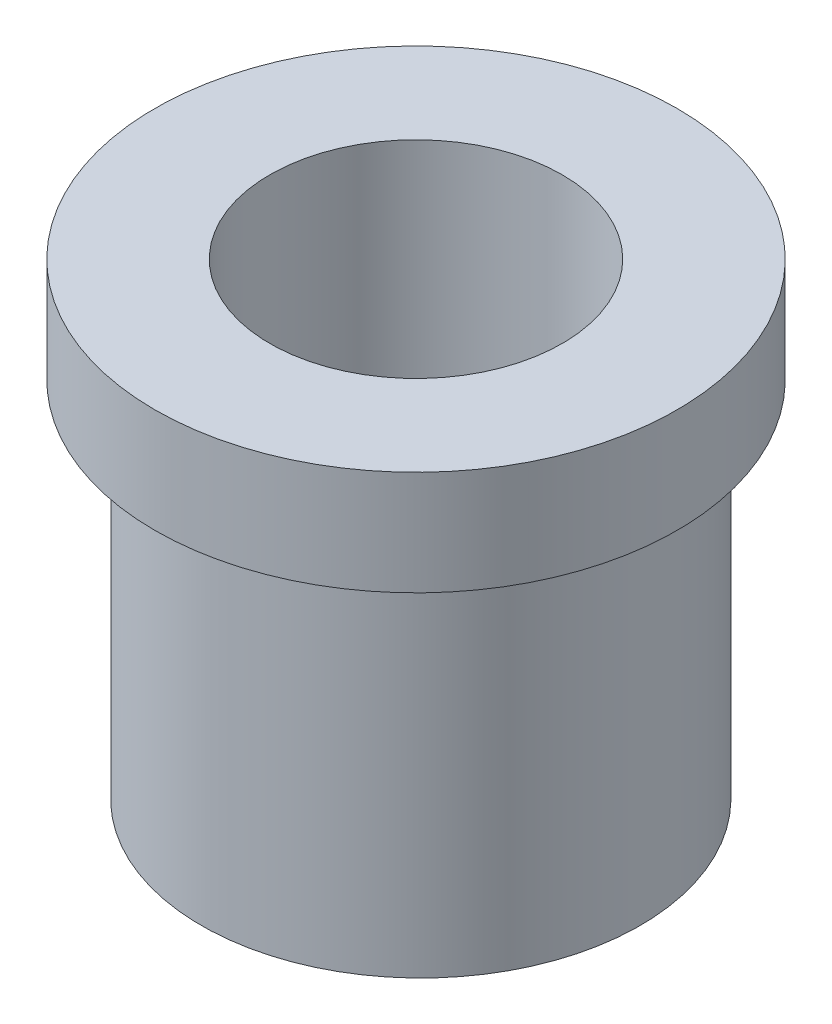
ISO-10303-21;
HEADER;
FILE_DESCRIPTION(('STEP AP214'),'2;1');
FILE_NAME('part.step','',(''),(''),'','','');
FILE_SCHEMA(('AUTOMOTIVE_DESIGN { 1 0 10303 214 1 1 1 1 }'));
ENDSEC;
DATA;
#1=APPLICATION_CONTEXT('core data for automotive mechanical design processes');
#2=APPLICATION_PROTOCOL_DEFINITION('international standard','automotive_design',2000,#1);
#3=PRODUCT_CONTEXT('',#1,'mechanical');
#4=PRODUCT('Part','Part','',(#3));
#5=PRODUCT_RELATED_PRODUCT_CATEGORY('part','',(#4));
#6=PRODUCT_DEFINITION_FORMATION('','',#4);
#7=PRODUCT_DEFINITION_CONTEXT('part definition',#1,'design');
#8=PRODUCT_DEFINITION('design','',#6,#7);
#9=PRODUCT_DEFINITION_SHAPE('','',#8);
#10=(LENGTH_UNIT() NAMED_UNIT(*) SI_UNIT(.MILLI.,.METRE.));
#11=(NAMED_UNIT(*) PLANE_ANGLE_UNIT() SI_UNIT($,.RADIAN.));
#12=(NAMED_UNIT(*) SI_UNIT($,.STERADIAN.) SOLID_ANGLE_UNIT());
#13=UNCERTAINTY_MEASURE_WITH_UNIT(LENGTH_MEASURE(1.E-05),#10,'distance_accuracy_value','');
#14=(GEOMETRIC_REPRESENTATION_CONTEXT(3) GLOBAL_UNCERTAINTY_ASSIGNED_CONTEXT((#13)) GLOBAL_UNIT_ASSIGNED_CONTEXT((#10,
#11,#12)) REPRESENTATION_CONTEXT('',''));
#15=CARTESIAN_POINT('',(0.,0.,0.));
#16=DIRECTION('',(0.,0.,1.));
#17=DIRECTION('',(1.,0.,0.));
#18=AXIS2_PLACEMENT_3D('',#15,#16,#17);
#19=CARTESIAN_POINT('',(0.,45.,-0.455240014745839));
#20=DIRECTION('',(0.,-1.,0.));
#21=DIRECTION('',(0.,0.,-1.));
#22=AXIS2_PLACEMENT_3D('',#19,#20,#21);
#23=CYLINDRICAL_SURFACE('',#22,21.);
#24=CARTESIAN_POINT('',(0.,0.,-0.455240014745839));
#25=DIRECTION('',(0.,1.,0.));
#26=DIRECTION('',(0.,0.,1.));
#27=AXIS2_PLACEMENT_3D('',#24,#25,#26);
#28=CIRCLE('',#27,21.);
#29=CARTESIAN_POINT('',(0.,0.,-21.4552400147458));
#30=VERTEX_POINT('',#29);
#31=EDGE_CURVE('E40',#30,#30,#28,.T.);
#32=CARTESIAN_POINT('',(0.,35.,-0.455240014745839));
#33=DIRECTION('',(0.,1.,0.));
#34=DIRECTION('',(0.,0.,1.));
#35=AXIS2_PLACEMENT_3D('',#32,#33,#34);
#36=CIRCLE('',#35,21.);
#37=CARTESIAN_POINT('',(0.,35.,-21.4552400147458));
#38=VERTEX_POINT('',#37);
#39=EDGE_CURVE('E10',#38,#38,#36,.T.);
#40=CARTESIAN_POINT('',(0.,0.,-21.4552400147458));
#41=CARTESIAN_POINT('',(0.,0.364583333333325,-21.4552400147458));
#42=CARTESIAN_POINT('',(0.,0.729166666666658,-21.4552400147458));
#43=CARTESIAN_POINT('',(0.,1.45833333333333,-21.4552400147458));
#44=CARTESIAN_POINT('',(0.,1.82291666666666,-21.4552400147458));
#45=CARTESIAN_POINT('',(0.,2.55208333333333,-21.4552400147458));
#46=CARTESIAN_POINT('',(0.,2.91666666666666,-21.4552400147458));
#47=CARTESIAN_POINT('',(0.,3.64583333333333,-21.4552400147458));
#48=CARTESIAN_POINT('',(0.,4.01041666666666,-21.4552400147458));
#49=CARTESIAN_POINT('',(0.,4.73958333333333,-21.4552400147458));
#50=CARTESIAN_POINT('',(0.,5.10416666666666,-21.4552400147458));
#51=CARTESIAN_POINT('',(0.,5.83333333333333,-21.4552400147458));
#52=CARTESIAN_POINT('',(0.,6.19791666666666,-21.4552400147458));
#53=CARTESIAN_POINT('',(0.,6.92708333333333,-21.4552400147458));
#54=CARTESIAN_POINT('',(0.,7.29166666666666,-21.4552400147458));
#55=CARTESIAN_POINT('',(0.,8.02083333333333,-21.4552400147458));
#56=CARTESIAN_POINT('',(0.,8.38541666666666,-21.4552400147458));
#57=CARTESIAN_POINT('',(0.,9.11458333333333,-21.4552400147458));
#58=CARTESIAN_POINT('',(0.,9.47916666666666,-21.4552400147458));
#59=CARTESIAN_POINT('',(0.,10.2083333333333,-21.4552400147458));
#60=CARTESIAN_POINT('',(0.,10.5729166666667,-21.4552400147458));
#61=CARTESIAN_POINT('',(0.,11.3020833333333,-21.4552400147458));
#62=CARTESIAN_POINT('',(0.,11.6666666666667,-21.4552400147458));
#63=CARTESIAN_POINT('',(0.,12.3958333333333,-21.4552400147458));
#64=CARTESIAN_POINT('',(0.,12.7604166666667,-21.4552400147458));
#65=CARTESIAN_POINT('',(0.,13.4895833333333,-21.4552400147458));
#66=CARTESIAN_POINT('',(0.,13.8541666666667,-21.4552400147458));
#67=CARTESIAN_POINT('',(0.,14.5833333333333,-21.4552400147458));
#68=CARTESIAN_POINT('',(0.,14.9479166666667,-21.4552400147458));
#69=CARTESIAN_POINT('',(0.,15.6770833333333,-21.4552400147458));
#70=CARTESIAN_POINT('',(0.,16.0416666666667,-21.4552400147458));
#71=CARTESIAN_POINT('',(0.,16.7708333333333,-21.4552400147458));
#72=CARTESIAN_POINT('',(0.,17.1354166666667,-21.4552400147458));
#73=CARTESIAN_POINT('',(0.,17.8645833333333,-21.4552400147458));
#74=CARTESIAN_POINT('',(0.,18.2291666666667,-21.4552400147458));
#75=CARTESIAN_POINT('',(0.,18.9583333333333,-21.4552400147458));
#76=CARTESIAN_POINT('',(0.,19.3229166666667,-21.4552400147458));
#77=CARTESIAN_POINT('',(0.,20.0520833333333,-21.4552400147458));
#78=CARTESIAN_POINT('',(0.,20.4166666666667,-21.4552400147458));
#79=CARTESIAN_POINT('',(0.,21.1458333333333,-21.4552400147458));
#80=CARTESIAN_POINT('',(0.,21.5104166666667,-21.4552400147458));
#81=CARTESIAN_POINT('',(0.,22.2395833333333,-21.4552400147458));
#82=CARTESIAN_POINT('',(0.,22.6041666666667,-21.4552400147458));
#83=CARTESIAN_POINT('',(0.,23.3333333333333,-21.4552400147458));
#84=CARTESIAN_POINT('',(0.,23.6979166666667,-21.4552400147458));
#85=CARTESIAN_POINT('',(0.,24.4270833333333,-21.4552400147458));
#86=CARTESIAN_POINT('',(0.,24.7916666666667,-21.4552400147458));
#87=CARTESIAN_POINT('',(0.,25.5208333333333,-21.4552400147458));
#88=CARTESIAN_POINT('',(0.,25.8854166666667,-21.4552400147458));
#89=CARTESIAN_POINT('',(0.,26.6145833333333,-21.4552400147458));
#90=CARTESIAN_POINT('',(0.,26.9791666666667,-21.4552400147458));
#91=CARTESIAN_POINT('',(0.,27.7083333333333,-21.4552400147458));
#92=CARTESIAN_POINT('',(0.,28.0729166666667,-21.4552400147458));
#93=CARTESIAN_POINT('',(0.,28.8020833333333,-21.4552400147458));
#94=CARTESIAN_POINT('',(0.,29.1666666666667,-21.4552400147458));
#95=CARTESIAN_POINT('',(0.,29.8958333333333,-21.4552400147458));
#96=CARTESIAN_POINT('',(0.,30.2604166666667,-21.4552400147458));
#97=CARTESIAN_POINT('',(0.,30.9895833333333,-21.4552400147458));
#98=CARTESIAN_POINT('',(0.,31.3541666666667,-21.4552400147458));
#99=CARTESIAN_POINT('',(0.,32.0833333333333,-21.4552400147458));
#100=CARTESIAN_POINT('',(0.,32.4479166666667,-21.4552400147458));
#101=CARTESIAN_POINT('',(0.,33.1770833333333,-21.4552400147458));
#102=CARTESIAN_POINT('',(0.,33.5416666666667,-21.4552400147458));
#103=CARTESIAN_POINT('',(0.,34.2708333333333,-21.4552400147458));
#104=CARTESIAN_POINT('',(0.,34.6354166666667,-21.4552400147458));
#105=CARTESIAN_POINT('',(0.,35.,-21.4552400147458));
#106=B_SPLINE_CURVE_WITH_KNOTS('',3,(#40,#41,#42,#43,#44,#45,#46,#47,#48,#49,#50,#51,#52,#53,
#54,#55,#56,#57,#58,#59,#60,#61,#62,#63,#64,#65,#66,#67,#68,#69,#70,#71,#72,#73,#74,#75,#76,#77,
#78,#79,#80,#81,#82,#83,#84,#85,#86,#87,#88,#89,#90,#91,#92,#93,#94,#95,#96,#97,#98,#99,#100,
#101,#102,#103,#104,#105),.UNSPECIFIED.,.F.,.F.,(4,2,2,2,2,2,2,2,2,2,2,2,2,2,2,2,2,2,2,2,2,2,2,
2,2,2,2,2,2,2,2,2,4),(0.,1.09375,2.1875,3.28125,4.375,5.46875,6.5625,7.65625,8.75,9.84375,
10.9375,12.03125,13.125,14.21875,15.3125,16.40625,17.5,18.59375,19.6875,20.78125,21.875,
22.96875,24.0625,25.15625,26.25,27.34375,28.4375,29.53125,30.625,31.71875,32.8125,33.90625,35.),.UNSPECIFIED.);
#107=EDGE_CURVE('BSEAM37',#30,#38,#106,.T.);
#108=ORIENTED_EDGE('',*,*,#31,.T.);
#109=ORIENTED_EDGE('',*,*,#39,.F.);
#110=ORIENTED_EDGE('',*,*,#107,.T.);
#111=ORIENTED_EDGE('',*,*,#107,.F.);
#112=EDGE_LOOP('',(#108,#110,#109,#111));
#113=FACE_BOUND('',#112,.T.);
#114=ADVANCED_FACE('F37',(#113),#23,.T.);
#115=CARTESIAN_POINT('',(0.,45.,-0.455240014745839));
#116=DIRECTION('',(0.,1.,0.));
#117=DIRECTION('',(0.,0.,1.));
#118=AXIS2_PLACEMENT_3D('',#115,#116,#117);
#119=PLANE('',#118);
#120=CARTESIAN_POINT('',(0.,45.,0.));
#121=DIRECTION('',(0.,1.,0.));
#122=DIRECTION('',(0.,0.,1.));
#123=AXIS2_PLACEMENT_3D('',#120,#121,#122);
#124=CIRCLE('',#123,14.);
#125=CARTESIAN_POINT('',(0.,45.,-14.));
#126=VERTEX_POINT('',#125);
#127=EDGE_CURVE('E48',#126,#126,#124,.T.);
#128=ORIENTED_EDGE('',*,*,#127,.F.);
#129=EDGE_LOOP('',(#128));
#130=FACE_BOUND('',#129,.T.);
#131=CARTESIAN_POINT('',(0.,45.,0.));
#132=DIRECTION('',(0.,1.,0.));
#133=DIRECTION('',(0.,0.,1.));
#134=AXIS2_PLACEMENT_3D('',#131,#132,#133);
#135=CIRCLE('',#134,25.);
#136=CARTESIAN_POINT('',(0.,45.,25.));
#137=VERTEX_POINT('',#136);
#138=EDGE_CURVE('E51',#137,#137,#135,.T.);
#139=ORIENTED_EDGE('',*,*,#138,.T.);
#140=EDGE_LOOP('',(#139));
#141=FACE_BOUND('',#140,.T.);
#142=ADVANCED_FACE('F65',(#130,#141),#119,.T.);
#143=CARTESIAN_POINT('',(0.,0.,-0.455240014745839));
#144=DIRECTION('',(0.,1.,0.));
#145=DIRECTION('',(0.,0.,1.));
#146=AXIS2_PLACEMENT_3D('',#143,#144,#145);
#147=PLANE('',#146);
#148=ORIENTED_EDGE('',*,*,#31,.F.);
#149=EDGE_LOOP('',(#148));
#150=FACE_BOUND('',#149,.T.);
#151=CARTESIAN_POINT('',(0.,0.,0.));
#152=DIRECTION('',(0.,1.,0.));
#153=DIRECTION('',(0.,0.,1.));
#154=AXIS2_PLACEMENT_3D('',#151,#152,#153);
#155=CIRCLE('',#154,14.);
#156=CARTESIAN_POINT('',(0.,0.,-14.));
#157=VERTEX_POINT('',#156);
#158=EDGE_CURVE('E54',#157,#157,#155,.T.);
#159=ORIENTED_EDGE('',*,*,#158,.T.);
#160=EDGE_LOOP('',(#159));
#161=FACE_BOUND('',#160,.T.);
#162=ADVANCED_FACE('F83',(#150,#161),#147,.F.);
#163=CARTESIAN_POINT('',(0.,45.,0.));
#164=DIRECTION('',(0.,-1.,0.));
#165=DIRECTION('',(0.,0.,-1.));
#166=AXIS2_PLACEMENT_3D('',#163,#164,#165);
#167=CYLINDRICAL_SURFACE('',#166,14.);
#168=CARTESIAN_POINT('',(0.,45.,-14.));
#169=CARTESIAN_POINT('',(0.,44.53125,-14.));
#170=CARTESIAN_POINT('',(0.,44.0625,-14.));
#171=CARTESIAN_POINT('',(0.,43.125,-14.));
#172=CARTESIAN_POINT('',(0.,42.65625,-14.));
#173=CARTESIAN_POINT('',(0.,41.71875,-14.));
#174=CARTESIAN_POINT('',(0.,41.25,-14.));
#175=CARTESIAN_POINT('',(0.,40.3125,-14.));
#176=CARTESIAN_POINT('',(0.,39.84375,-14.));
#177=CARTESIAN_POINT('',(0.,38.90625,-14.));
#178=CARTESIAN_POINT('',(0.,38.4375,-14.));
#179=CARTESIAN_POINT('',(0.,37.5,-14.));
#180=CARTESIAN_POINT('',(0.,37.03125,-14.));
#181=CARTESIAN_POINT('',(0.,36.09375,-14.));
#182=CARTESIAN_POINT('',(0.,35.625,-14.));
#183=CARTESIAN_POINT('',(0.,34.6875,-14.));
#184=CARTESIAN_POINT('',(0.,34.21875,-14.));
#185=CARTESIAN_POINT('',(0.,33.28125,-14.));
#186=CARTESIAN_POINT('',(0.,32.8125,-14.));
#187=CARTESIAN_POINT('',(0.,31.875,-14.));
#188=CARTESIAN_POINT('',(0.,31.40625,-14.));
#189=CARTESIAN_POINT('',(0.,30.46875,-14.));
#190=CARTESIAN_POINT('',(0.,30.,-14.));
#191=CARTESIAN_POINT('',(0.,29.0625,-14.));
#192=CARTESIAN_POINT('',(0.,28.59375,-14.));
#193=CARTESIAN_POINT('',(0.,27.65625,-14.));
#194=CARTESIAN_POINT('',(0.,27.1875,-14.));
#195=CARTESIAN_POINT('',(0.,26.25,-14.));
#196=CARTESIAN_POINT('',(0.,25.78125,-14.));
#197=CARTESIAN_POINT('',(0.,24.84375,-14.));
#198=CARTESIAN_POINT('',(0.,24.375,-14.));
#199=CARTESIAN_POINT('',(0.,23.4375,-14.));
#200=CARTESIAN_POINT('',(0.,22.96875,-14.));
#201=CARTESIAN_POINT('',(0.,22.03125,-14.));
#202=CARTESIAN_POINT('',(0.,21.5625,-14.));
#203=CARTESIAN_POINT('',(0.,20.625,-14.));
#204=CARTESIAN_POINT('',(0.,20.15625,-14.));
#205=CARTESIAN_POINT('',(0.,19.21875,-14.));
#206=CARTESIAN_POINT('',(0.,18.75,-14.));
#207=CARTESIAN_POINT('',(0.,17.8125,-14.));
#208=CARTESIAN_POINT('',(0.,17.34375,-14.));
#209=CARTESIAN_POINT('',(0.,16.40625,-14.));
#210=CARTESIAN_POINT('',(0.,15.9375,-14.));
#211=CARTESIAN_POINT('',(0.,15.,-14.));
#212=CARTESIAN_POINT('',(0.,14.53125,-14.));
#213=CARTESIAN_POINT('',(0.,13.59375,-14.));
#214=CARTESIAN_POINT('',(0.,13.125,-14.));
#215=CARTESIAN_POINT('',(0.,12.1875,-14.));
#216=CARTESIAN_POINT('',(0.,11.71875,-14.));
#217=CARTESIAN_POINT('',(0.,10.78125,-14.));
#218=CARTESIAN_POINT('',(0.,10.3125,-14.));
#219=CARTESIAN_POINT('',(0.,9.375,-14.));
#220=CARTESIAN_POINT('',(0.,8.90625,-14.));
#221=CARTESIAN_POINT('',(0.,7.96874999999999,-14.));
#222=CARTESIAN_POINT('',(0.,7.5,-14.));
#223=CARTESIAN_POINT('',(0.,6.5625,-14.));
#224=CARTESIAN_POINT('',(0.,6.09375,-14.));
#225=CARTESIAN_POINT('',(0.,5.15625,-14.));
#226=CARTESIAN_POINT('',(0.,4.68749999999999,-14.));
#227=CARTESIAN_POINT('',(0.,3.74999999999999,-14.));
#228=CARTESIAN_POINT('',(0.,3.28124999999999,-14.));
#229=CARTESIAN_POINT('',(0.,2.34374999999999,-14.));
#230=CARTESIAN_POINT('',(0.,1.87499999999999,-14.));
#231=CARTESIAN_POINT('',(0.,0.937499999999992,-14.));
#232=CARTESIAN_POINT('',(0.,0.468749999999993,-14.));
#233=CARTESIAN_POINT('',(0.,0.,-14.));
#234=B_SPLINE_CURVE_WITH_KNOTS('',3,(#168,#169,#170,#171,#172,#173,#174,#175,#176,#177,#178,
#179,#180,#181,#182,#183,#184,#185,#186,#187,#188,#189,#190,#191,#192,#193,#194,#195,#196,#197,
#198,#199,#200,#201,#202,#203,#204,#205,#206,#207,#208,#209,#210,#211,#212,#213,#214,#215,#216,
#217,#218,#219,#220,#221,#222,#223,#224,#225,#226,#227,#228,#229,#230,#231,#232,#233),
.UNSPECIFIED.,.F.,.F.,(4,2,2,2,2,2,2,2,2,2,2,2,2,2,2,2,2,2,2,2,2,2,2,2,2,2,2,2,2,2,2,2,4),(0.,
1.40625,2.8125,4.21875000000001,5.62500000000001,7.03125,8.4375,9.84375000000001,11.25,12.65625,
14.0625,15.46875,16.875,18.28125,19.6875,21.09375,22.5,23.90625,25.3125,26.71875,28.125,
29.53125,30.9375,32.34375,33.75,35.15625,36.5625,37.96875,39.375,40.78125,42.1875,43.59375,45.),.UNSPECIFIED.);
#235=EDGE_CURVE('BSEAM74',#126,#157,#234,.T.);
#236=ORIENTED_EDGE('',*,*,#127,.T.);
#237=ORIENTED_EDGE('',*,*,#158,.F.);
#238=ORIENTED_EDGE('',*,*,#235,.T.);
#239=ORIENTED_EDGE('',*,*,#235,.F.);
#240=EDGE_LOOP('',(#236,#238,#237,#239));
#241=FACE_BOUND('',#240,.T.);
#242=ADVANCED_FACE('F74',(#241),#167,.F.);
#243=CARTESIAN_POINT('',(0.,35.,0.));
#244=DIRECTION('',(0.,1.,0.));
#245=DIRECTION('',(0.,0.,1.));
#246=AXIS2_PLACEMENT_3D('',#243,#244,#245);
#247=PLANE('',#246);
#248=CARTESIAN_POINT('',(0.,35.,0.));
#249=DIRECTION('',(0.,1.,0.));
#250=DIRECTION('',(0.,0.,1.));
#251=AXIS2_PLACEMENT_3D('',#248,#249,#250);
#252=CIRCLE('',#251,25.);
#253=CARTESIAN_POINT('',(0.,35.,25.));
#254=VERTEX_POINT('',#253);
#255=EDGE_CURVE('E56',#254,#254,#252,.T.);
#256=ORIENTED_EDGE('',*,*,#255,.F.);
#257=EDGE_LOOP('',(#256));
#258=FACE_BOUND('',#257,.T.);
#259=ORIENTED_EDGE('',*,*,#39,.T.);
#260=EDGE_LOOP('',(#259));
#261=FACE_BOUND('',#260,.T.);
#262=ADVANCED_FACE('F69',(#258,#261),#247,.F.);
#263=CARTESIAN_POINT('',(0.,35.,0.));
#264=DIRECTION('',(0.,1.,0.));
#265=DIRECTION('',(0.,0.,1.));
#266=AXIS2_PLACEMENT_3D('',#263,#264,#265);
#267=CYLINDRICAL_SURFACE('',#266,25.);
#268=ORIENTED_EDGE('',*,*,#255,.T.);
#269=EDGE_LOOP('',(#268));
#270=FACE_BOUND('',#269,.T.);
#271=ORIENTED_EDGE('',*,*,#138,.F.);
#272=EDGE_LOOP('',(#271));
#273=FACE_BOUND('',#272,.T.);
#274=ADVANCED_FACE('F67',(#270,#273),#267,.T.);
#275=CLOSED_SHELL('',(#114,#142,#162,#242,#262,#274));
#276=MANIFOLD_SOLID_BREP('B2',#275);
#277=ADVANCED_BREP_SHAPE_REPRESENTATION('',(#18,#276),#14);
#278=SHAPE_DEFINITION_REPRESENTATION(#9,#277);
ENDSEC;
END-ISO-10303-21;
